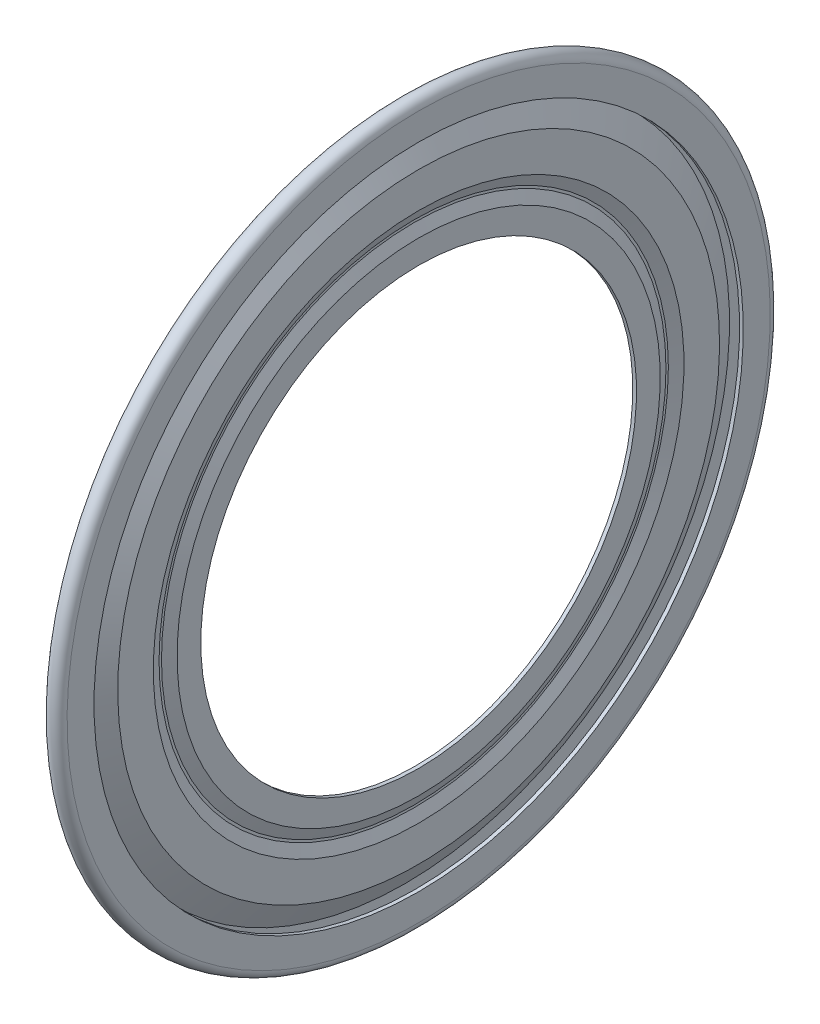
ISO-10303-21;
HEADER;
FILE_DESCRIPTION(('STEP AP214'),'2;1');
FILE_NAME('part.step','',(''),(''),'','','');
FILE_SCHEMA(('AUTOMOTIVE_DESIGN { 1 0 10303 214 1 1 1 1 }'));
ENDSEC;
DATA;
#1=APPLICATION_CONTEXT('core data for automotive mechanical design processes');
#2=APPLICATION_PROTOCOL_DEFINITION('international standard','automotive_design',2000,#1);
#3=PRODUCT_CONTEXT('',#1,'mechanical');
#4=PRODUCT('Part','Part','',(#3));
#5=PRODUCT_RELATED_PRODUCT_CATEGORY('part','',(#4));
#6=PRODUCT_DEFINITION_FORMATION('','',#4);
#7=PRODUCT_DEFINITION_CONTEXT('part definition',#1,'design');
#8=PRODUCT_DEFINITION('design','',#6,#7);
#9=PRODUCT_DEFINITION_SHAPE('','',#8);
#10=(LENGTH_UNIT() NAMED_UNIT(*) SI_UNIT(.MILLI.,.METRE.));
#11=(NAMED_UNIT(*) PLANE_ANGLE_UNIT() SI_UNIT($,.RADIAN.));
#12=(NAMED_UNIT(*) SI_UNIT($,.STERADIAN.) SOLID_ANGLE_UNIT());
#13=UNCERTAINTY_MEASURE_WITH_UNIT(LENGTH_MEASURE(1.E-05),#10,'distance_accuracy_value','');
#14=(GEOMETRIC_REPRESENTATION_CONTEXT(3) GLOBAL_UNCERTAINTY_ASSIGNED_CONTEXT((#13)) GLOBAL_UNIT_ASSIGNED_CONTEXT((#10,
#11,#12)) REPRESENTATION_CONTEXT('',''));
#15=CARTESIAN_POINT('',(0.,0.,0.));
#16=DIRECTION('',(0.,0.,1.));
#17=DIRECTION('',(1.,0.,0.));
#18=AXIS2_PLACEMENT_3D('',#15,#16,#17);
#19=CARTESIAN_POINT('',(6.88333333333333,7.6361065493034,0.));
#20=DIRECTION('',(1.,0.,0.));
#21=DIRECTION('',(0.,-1.,0.));
#22=AXIS2_PLACEMENT_3D('',#19,#20,#21);
#23=PLANE('',#22);
#24=CARTESIAN_POINT('',(6.88333333333333,0.,0.));
#25=DIRECTION('',(-1.,0.,0.));
#26=DIRECTION('',(0.,1.,0.));
#27=AXIS2_PLACEMENT_3D('',#24,#25,#26);
#28=CIRCLE('',#27,7.15613672177468);
#29=CARTESIAN_POINT('',(6.88333333333333,7.15613672177468,0.));
#30=VERTEX_POINT('',#29);
#31=EDGE_CURVE('E11',#30,#30,#28,.T.);
#32=ORIENTED_EDGE('',*,*,#31,.T.);
#33=EDGE_LOOP('',(#32));
#34=FACE_BOUND('',#33,.T.);
#35=CARTESIAN_POINT('',(6.88333333333333,0.,0.));
#36=DIRECTION('',(-1.,0.,0.));
#37=DIRECTION('',(0.,1.,0.));
#38=AXIS2_PLACEMENT_3D('',#35,#36,#37);
#39=CIRCLE('',#38,8.11607637683213);
#40=CARTESIAN_POINT('',(6.88333333333333,8.11607637683213,0.));
#41=VERTEX_POINT('',#40);
#42=EDGE_CURVE('E106',#41,#41,#39,.T.);
#43=ORIENTED_EDGE('',*,*,#42,.F.);
#44=EDGE_LOOP('',(#43));
#45=FACE_BOUND('',#44,.T.);
#46=ADVANCED_FACE('F17',(#34,#45),#23,.T.);
#47=CARTESIAN_POINT('',(6.81666666666667,0.,0.));
#48=DIRECTION('',(1.,0.,0.));
#49=DIRECTION('',(0.,1.,0.));
#50=AXIS2_PLACEMENT_3D('',#47,#48,#49);
#51=CONICAL_SURFACE('',#50,7.01240572463582,1.13650154520197);
#52=CARTESIAN_POINT('',(6.75,0.,0.));
#53=DIRECTION('',(-1.,0.,0.));
#54=DIRECTION('',(0.,1.,0.));
#55=AXIS2_PLACEMENT_3D('',#52,#53,#54);
#56=CIRCLE('',#55,6.86867472749696);
#57=CARTESIAN_POINT('',(6.75,6.86867472749696,0.));
#58=VERTEX_POINT('',#57);
#59=EDGE_CURVE('E27',#58,#58,#56,.T.);
#60=ORIENTED_EDGE('',*,*,#59,.T.);
#61=EDGE_LOOP('',(#60));
#62=FACE_BOUND('',#61,.T.);
#63=ORIENTED_EDGE('',*,*,#31,.F.);
#64=EDGE_LOOP('',(#63));
#65=FACE_BOUND('',#64,.T.);
#66=ADVANCED_FACE('F160',(#62,#65),#51,.F.);
#67=CARTESIAN_POINT('',(6.75,6.83615683675553,0.));
#68=DIRECTION('',(1.,0.,0.));
#69=DIRECTION('',(0.,-1.,0.));
#70=AXIS2_PLACEMENT_3D('',#67,#68,#69);
#71=PLANE('',#70);
#72=CARTESIAN_POINT('',(6.75,0.,0.));
#73=DIRECTION('',(-1.,0.,0.));
#74=DIRECTION('',(0.,1.,0.));
#75=AXIS2_PLACEMENT_3D('',#72,#73,#74);
#76=CIRCLE('',#75,6.8036389460141);
#77=CARTESIAN_POINT('',(6.75,6.8036389460141,0.));
#78=VERTEX_POINT('',#77);
#79=EDGE_CURVE('E130',#78,#78,#76,.T.);
#80=ORIENTED_EDGE('',*,*,#79,.T.);
#81=EDGE_LOOP('',(#80));
#82=FACE_BOUND('',#81,.T.);
#83=ORIENTED_EDGE('',*,*,#59,.F.);
#84=EDGE_LOOP('',(#83));
#85=FACE_BOUND('',#84,.T.);
#86=ADVANCED_FACE('F165',(#82,#85),#71,.T.);
#87=CARTESIAN_POINT('',(6.81666666666667,0.,0.));
#88=DIRECTION('',(-1.,0.,0.));
#89=DIRECTION('',(0.,1.,0.));
#90=AXIS2_PLACEMENT_3D('',#87,#88,#89);
#91=CONICAL_SURFACE('',#90,6.65990794887524,1.13650154520197);
#92=CARTESIAN_POINT('',(6.88333333333333,0.,0.));
#93=DIRECTION('',(-1.,0.,0.));
#94=DIRECTION('',(0.,1.,0.));
#95=AXIS2_PLACEMENT_3D('',#92,#93,#94);
#96=CIRCLE('',#95,6.51617695173638);
#97=CARTESIAN_POINT('',(6.88333333333333,6.51617695173638,0.));
#98=VERTEX_POINT('',#97);
#99=EDGE_CURVE('E117',#98,#98,#96,.T.);
#100=ORIENTED_EDGE('',*,*,#99,.T.);
#101=EDGE_LOOP('',(#100));
#102=FACE_BOUND('',#101,.T.);
#103=ORIENTED_EDGE('',*,*,#79,.F.);
#104=EDGE_LOOP('',(#103));
#105=FACE_BOUND('',#104,.T.);
#106=ADVANCED_FACE('F175',(#102,#105),#91,.T.);
#107=CARTESIAN_POINT('',(6.88333333333333,6.19619706671723,0.));
#108=DIRECTION('',(1.,0.,0.));
#109=DIRECTION('',(0.,-1.,0.));
#110=AXIS2_PLACEMENT_3D('',#107,#108,#109);
#111=PLANE('',#110);
#112=CARTESIAN_POINT('',(6.88333333333333,0.,0.));
#113=DIRECTION('',(-1.,0.,0.));
#114=DIRECTION('',(0.,1.,0.));
#115=AXIS2_PLACEMENT_3D('',#112,#113,#114);
#116=CIRCLE('',#115,5.87621718169808);
#117=CARTESIAN_POINT('',(6.88333333333333,5.87621718169808,0.));
#118=VERTEX_POINT('',#117);
#119=EDGE_CURVE('E115',#118,#118,#116,.T.);
#120=ORIENTED_EDGE('',*,*,#119,.T.);
#121=EDGE_LOOP('',(#120));
#122=FACE_BOUND('',#121,.T.);
#123=ORIENTED_EDGE('',*,*,#99,.F.);
#124=EDGE_LOOP('',(#123));
#125=FACE_BOUND('',#124,.T.);
#126=ADVANCED_FACE('F171',(#122,#125),#111,.T.);
#127=CARTESIAN_POINT('',(6.83333333333333,0.,0.));
#128=DIRECTION('',(1.,0.,0.));
#129=DIRECTION('',(0.,1.,0.));
#130=AXIS2_PLACEMENT_3D('',#127,#128,#129);
#131=CYLINDRICAL_SURFACE('',#130,5.87621718169808);
#132=CARTESIAN_POINT('',(6.78333333333333,0.,0.));
#133=DIRECTION('',(-1.,0.,0.));
#134=DIRECTION('',(0.,1.,0.));
#135=AXIS2_PLACEMENT_3D('',#132,#133,#134);
#136=CIRCLE('',#135,5.87621718169808);
#137=CARTESIAN_POINT('',(6.78333333333333,5.87621718169808,0.));
#138=VERTEX_POINT('',#137);
#139=EDGE_CURVE('E118',#138,#138,#136,.T.);
#140=ORIENTED_EDGE('',*,*,#139,.T.);
#141=EDGE_LOOP('',(#140));
#142=FACE_BOUND('',#141,.T.);
#143=ORIENTED_EDGE('',*,*,#119,.F.);
#144=EDGE_LOOP('',(#143));
#145=FACE_BOUND('',#144,.T.);
#146=ADVANCED_FACE('F174',(#142,#145),#131,.F.);
#147=CARTESIAN_POINT('',(6.78333333333333,6.18516576336283,0.));
#148=DIRECTION('',(-1.,0.,0.));
#149=DIRECTION('',(0.,1.,0.));
#150=AXIS2_PLACEMENT_3D('',#147,#148,#149);
#151=PLANE('',#150);
#152=CARTESIAN_POINT('',(6.78333333333333,0.,0.));
#153=DIRECTION('',(-1.,0.,0.));
#154=DIRECTION('',(0.,1.,0.));
#155=AXIS2_PLACEMENT_3D('',#152,#153,#154);
#156=CIRCLE('',#155,6.49411434502759);
#157=CARTESIAN_POINT('',(6.78333333333333,6.49411434502759,0.));
#158=VERTEX_POINT('',#157);
#159=EDGE_CURVE('E133',#158,#158,#156,.T.);
#160=ORIENTED_EDGE('',*,*,#159,.T.);
#161=EDGE_LOOP('',(#160));
#162=FACE_BOUND('',#161,.T.);
#163=ORIENTED_EDGE('',*,*,#139,.F.);
#164=EDGE_LOOP('',(#163));
#165=FACE_BOUND('',#164,.T.);
#166=ADVANCED_FACE('F193',(#162,#165),#151,.T.);
#167=CARTESIAN_POINT('',(6.71666666666667,0.,0.));
#168=DIRECTION('',(-1.,0.,0.));
#169=DIRECTION('',(0.,1.,0.));
#170=AXIS2_PLACEMENT_3D('',#167,#168,#169);
#171=CONICAL_SURFACE('',#170,6.63784534216645,1.13650154520197);
#172=CARTESIAN_POINT('',(6.65,0.,0.));
#173=DIRECTION('',(-1.,0.,0.));
#174=DIRECTION('',(0.,1.,0.));
#175=AXIS2_PLACEMENT_3D('',#172,#173,#174);
#176=CIRCLE('',#175,6.78157633930531);
#177=CARTESIAN_POINT('',(6.65,6.78157633930531,0.));
#178=VERTEX_POINT('',#177);
#179=EDGE_CURVE('E114',#178,#178,#176,.T.);
#180=ORIENTED_EDGE('',*,*,#179,.T.);
#181=EDGE_LOOP('',(#180));
#182=FACE_BOUND('',#181,.T.);
#183=ORIENTED_EDGE('',*,*,#159,.F.);
#184=EDGE_LOOP('',(#183));
#185=FACE_BOUND('',#184,.T.);
#186=ADVANCED_FACE('F195',(#182,#185),#171,.F.);
#187=CARTESIAN_POINT('',(6.65,6.83615683675553,0.));
#188=DIRECTION('',(-1.,0.,0.));
#189=DIRECTION('',(0.,1.,0.));
#190=AXIS2_PLACEMENT_3D('',#187,#188,#189);
#191=PLANE('',#190);
#192=CARTESIAN_POINT('',(6.65,0.,0.));
#193=DIRECTION('',(-1.,0.,0.));
#194=DIRECTION('',(0.,1.,0.));
#195=AXIS2_PLACEMENT_3D('',#192,#193,#194);
#196=CIRCLE('',#195,6.89073733420575);
#197=CARTESIAN_POINT('',(6.65,6.89073733420575,0.));
#198=VERTEX_POINT('',#197);
#199=EDGE_CURVE('E112',#198,#198,#196,.T.);
#200=ORIENTED_EDGE('',*,*,#199,.T.);
#201=EDGE_LOOP('',(#200));
#202=FACE_BOUND('',#201,.T.);
#203=ORIENTED_EDGE('',*,*,#179,.F.);
#204=EDGE_LOOP('',(#203));
#205=FACE_BOUND('',#204,.T.);
#206=ADVANCED_FACE('F155',(#202,#205),#191,.T.);
#207=CARTESIAN_POINT('',(6.71666666666667,0.,0.));
#208=DIRECTION('',(1.,0.,0.));
#209=DIRECTION('',(0.,1.,0.));
#210=AXIS2_PLACEMENT_3D('',#207,#208,#209);
#211=CONICAL_SURFACE('',#210,7.03446833134461,1.13650154520197);
#212=CARTESIAN_POINT('',(6.78333333333333,0.,0.));
#213=DIRECTION('',(-1.,0.,0.));
#214=DIRECTION('',(0.,1.,0.));
#215=AXIS2_PLACEMENT_3D('',#212,#213,#214);
#216=CIRCLE('',#215,7.17819932848347);
#217=CARTESIAN_POINT('',(6.78333333333333,7.17819932848347,0.));
#218=VERTEX_POINT('',#217);
#219=EDGE_CURVE('E21',#218,#218,#216,.T.);
#220=ORIENTED_EDGE('',*,*,#219,.T.);
#221=EDGE_LOOP('',(#220));
#222=FACE_BOUND('',#221,.T.);
#223=ORIENTED_EDGE('',*,*,#199,.F.);
#224=EDGE_LOOP('',(#223));
#225=FACE_BOUND('',#224,.T.);
#226=ADVANCED_FACE('F140',(#222,#225),#211,.T.);
#227=CARTESIAN_POINT('',(6.78333333333333,7.63374039303625,0.));
#228=DIRECTION('',(-1.,0.,0.));
#229=DIRECTION('',(0.,1.,0.));
#230=AXIS2_PLACEMENT_3D('',#227,#228,#229);
#231=PLANE('',#230);
#232=CARTESIAN_POINT('',(6.78333333333333,0.,0.));
#233=DIRECTION('',(-1.,0.,0.));
#234=DIRECTION('',(0.,1.,0.));
#235=AXIS2_PLACEMENT_3D('',#232,#233,#234);
#236=CIRCLE('',#235,8.08928145758902);
#237=CARTESIAN_POINT('',(6.78333333333333,8.08928145758902,0.));
#238=VERTEX_POINT('',#237);
#239=EDGE_CURVE('E110',#238,#238,#236,.T.);
#240=ORIENTED_EDGE('',*,*,#239,.T.);
#241=EDGE_LOOP('',(#240));
#242=FACE_BOUND('',#241,.T.);
#243=ORIENTED_EDGE('',*,*,#219,.F.);
#244=EDGE_LOOP('',(#243));
#245=FACE_BOUND('',#244,.T.);
#246=ADVANCED_FACE('F143',(#242,#245),#231,.T.);
#247=CARTESIAN_POINT('',(6.6,0.,0.));
#248=DIRECTION('',(-1.,0.,0.));
#249=DIRECTION('',(0.,1.,0.));
#250=AXIS2_PLACEMENT_3D('',#247,#248,#249);
#251=CONICAL_SURFACE('',#250,8.40682410564331,1.0471975511966);
#252=CARTESIAN_POINT('',(6.41666666666667,0.,0.));
#253=DIRECTION('',(-1.,0.,0.));
#254=DIRECTION('',(0.,1.,0.));
#255=AXIS2_PLACEMENT_3D('',#252,#253,#254);
#256=CIRCLE('',#255,8.7243667536976);
#257=CARTESIAN_POINT('',(6.41666666666667,8.7243667536976,0.));
#258=VERTEX_POINT('',#257);
#259=EDGE_CURVE('E109',#258,#258,#256,.T.);
#260=ORIENTED_EDGE('',*,*,#259,.T.);
#261=EDGE_LOOP('',(#260));
#262=FACE_BOUND('',#261,.T.);
#263=ORIENTED_EDGE('',*,*,#239,.F.);
#264=EDGE_LOOP('',(#263));
#265=FACE_BOUND('',#264,.T.);
#266=ADVANCED_FACE('F145',(#262,#265),#251,.F.);
#267=CARTESIAN_POINT('',(6.41666666666667,9.10350461114607,0.));
#268=DIRECTION('',(-1.,0.,0.));
#269=DIRECTION('',(0.,1.,0.));
#270=AXIS2_PLACEMENT_3D('',#267,#268,#269);
#271=PLANE('',#270);
#272=CARTESIAN_POINT('',(6.41666666666667,0.,0.));
#273=DIRECTION('',(-1.,0.,0.));
#274=DIRECTION('',(0.,1.,0.));
#275=AXIS2_PLACEMENT_3D('',#272,#273,#274);
#276=CIRCLE('',#275,9.48264246859454);
#277=CARTESIAN_POINT('',(6.41666666666667,9.48264246859454,0.));
#278=VERTEX_POINT('',#277);
#279=EDGE_CURVE('E78',#278,#278,#276,.T.);
#280=ORIENTED_EDGE('',*,*,#279,.T.);
#281=EDGE_LOOP('',(#280));
#282=FACE_BOUND('',#281,.T.);
#283=ORIENTED_EDGE('',*,*,#259,.F.);
#284=EDGE_LOOP('',(#283));
#285=FACE_BOUND('',#284,.T.);
#286=ADVANCED_FACE('F152',(#282,#285),#271,.T.);
#287=CARTESIAN_POINT('',(6.65,0.,0.));
#288=DIRECTION('',(-1.,0.,0.));
#289=DIRECTION('',(0.,0.,1.));
#290=AXIS2_PLACEMENT_3D('',#287,#288,#289);
#291=TOROIDAL_SURFACE('',#290,9.48264246859454,0.233333333333334);
#292=CARTESIAN_POINT('',(6.88333333333333,0.,0.));
#293=DIRECTION('',(-1.,0.,0.));
#294=DIRECTION('',(0.,1.,0.));
#295=AXIS2_PLACEMENT_3D('',#292,#293,#294);
#296=CIRCLE('',#295,9.48264246859454);
#297=CARTESIAN_POINT('',(6.88333333333333,9.48264246859454,0.));
#298=VERTEX_POINT('',#297);
#299=EDGE_CURVE('E73',#298,#298,#296,.T.);
#300=ORIENTED_EDGE('',*,*,#299,.T.);
#301=EDGE_LOOP('',(#300));
#302=FACE_BOUND('',#301,.T.);
#303=ORIENTED_EDGE('',*,*,#279,.F.);
#304=EDGE_LOOP('',(#303));
#305=FACE_BOUND('',#304,.T.);
#306=ADVANCED_FACE('F19',(#302,#305),#291,.T.);
#307=CARTESIAN_POINT('',(6.88333333333333,9.11933930773249,0.));
#308=DIRECTION('',(1.,0.,0.));
#309=DIRECTION('',(0.,-1.,0.));
#310=AXIS2_PLACEMENT_3D('',#307,#308,#309);
#311=PLANE('',#310);
#312=CARTESIAN_POINT('',(6.88333333333333,0.,0.));
#313=DIRECTION('',(-1.,0.,0.));
#314=DIRECTION('',(0.,1.,0.));
#315=AXIS2_PLACEMENT_3D('',#312,#313,#314);
#316=CIRCLE('',#315,8.75603614687043);
#317=CARTESIAN_POINT('',(6.88333333333333,8.75603614687043,0.));
#318=VERTEX_POINT('',#317);
#319=EDGE_CURVE('E100',#318,#318,#316,.T.);
#320=ORIENTED_EDGE('',*,*,#319,.T.);
#321=EDGE_LOOP('',(#320));
#322=FACE_BOUND('',#321,.T.);
#323=ORIENTED_EDGE('',*,*,#299,.F.);
#324=EDGE_LOOP('',(#323));
#325=FACE_BOUND('',#324,.T.);
#326=ADVANCED_FACE('F177',(#322,#325),#311,.T.);
#327=CARTESIAN_POINT('',(6.83333333333333,0.,0.));
#328=DIRECTION('',(1.,0.,0.));
#329=DIRECTION('',(0.,1.,0.));
#330=AXIS2_PLACEMENT_3D('',#327,#328,#329);
#331=CYLINDRICAL_SURFACE('',#330,8.75603614687043);
#332=CARTESIAN_POINT('',(6.78333333333333,0.,0.));
#333=DIRECTION('',(-1.,0.,0.));
#334=DIRECTION('',(0.,1.,0.));
#335=AXIS2_PLACEMENT_3D('',#332,#333,#334);
#336=CIRCLE('',#335,8.75603614687043);
#337=CARTESIAN_POINT('',(6.78333333333333,8.75603614687043,0.));
#338=VERTEX_POINT('',#337);
#339=EDGE_CURVE('E96',#338,#338,#336,.T.);
#340=ORIENTED_EDGE('',*,*,#339,.T.);
#341=EDGE_LOOP('',(#340));
#342=FACE_BOUND('',#341,.T.);
#343=ORIENTED_EDGE('',*,*,#319,.F.);
#344=EDGE_LOOP('',(#343));
#345=FACE_BOUND('',#344,.T.);
#346=ADVANCED_FACE('F97',(#342,#345),#331,.F.);
#347=CARTESIAN_POINT('',(6.78333333333333,9.11933930773249,0.));
#348=DIRECTION('',(-1.,0.,0.));
#349=DIRECTION('',(0.,1.,0.));
#350=AXIS2_PLACEMENT_3D('',#347,#348,#349);
#351=PLANE('',#350);
#352=CARTESIAN_POINT('',(6.78333333333333,0.,0.));
#353=DIRECTION('',(-1.,0.,0.));
#354=DIRECTION('',(0.,1.,0.));
#355=AXIS2_PLACEMENT_3D('',#352,#353,#354);
#356=CIRCLE('',#355,9.48264246859454);
#357=CARTESIAN_POINT('',(6.78333333333333,9.48264246859454,0.));
#358=VERTEX_POINT('',#357);
#359=EDGE_CURVE('E92',#358,#358,#356,.T.);
#360=ORIENTED_EDGE('',*,*,#359,.T.);
#361=EDGE_LOOP('',(#360));
#362=FACE_BOUND('',#361,.T.);
#363=ORIENTED_EDGE('',*,*,#339,.F.);
#364=EDGE_LOOP('',(#363));
#365=FACE_BOUND('',#364,.T.);
#366=ADVANCED_FACE('F183',(#362,#365),#351,.T.);
#367=CARTESIAN_POINT('',(6.65,0.,0.));
#368=DIRECTION('',(-1.,0.,0.));
#369=DIRECTION('',(0.,0.,1.));
#370=AXIS2_PLACEMENT_3D('',#367,#368,#369);
#371=TOROIDAL_SURFACE('',#370,9.48264246859454,0.133333333333333);
#372=CARTESIAN_POINT('',(6.51666666666667,0.,0.));
#373=DIRECTION('',(-1.,0.,0.));
#374=DIRECTION('',(0.,1.,0.));
#375=AXIS2_PLACEMENT_3D('',#372,#373,#374);
#376=CIRCLE('',#375,9.48264246859454);
#377=CARTESIAN_POINT('',(6.51666666666667,9.48264246859454,0.));
#378=VERTEX_POINT('',#377);
#379=EDGE_CURVE('E103',#378,#378,#376,.T.);
#380=ORIENTED_EDGE('',*,*,#379,.T.);
#381=EDGE_LOOP('',(#380));
#382=FACE_BOUND('',#381,.T.);
#383=ORIENTED_EDGE('',*,*,#359,.F.);
#384=EDGE_LOOP('',(#383));
#385=FACE_BOUND('',#384,.T.);
#386=ADVANCED_FACE('F188',(#382,#385),#371,.F.);
#387=CARTESIAN_POINT('',(6.51666666666667,9.11690207076763,0.));
#388=DIRECTION('',(1.,0.,0.));
#389=DIRECTION('',(0.,-1.,0.));
#390=AXIS2_PLACEMENT_3D('',#387,#388,#389);
#391=PLANE('',#390);
#392=CARTESIAN_POINT('',(6.51666666666667,0.,0.));
#393=DIRECTION('',(-1.,0.,0.));
#394=DIRECTION('',(0.,1.,0.));
#395=AXIS2_PLACEMENT_3D('',#392,#393,#394);
#396=CIRCLE('',#395,8.75116167294072);
#397=CARTESIAN_POINT('',(6.51666666666667,8.75116167294072,0.));
#398=VERTEX_POINT('',#397);
#399=EDGE_CURVE('E119',#398,#398,#396,.T.);
#400=ORIENTED_EDGE('',*,*,#399,.T.);
#401=EDGE_LOOP('',(#400));
#402=FACE_BOUND('',#401,.T.);
#403=ORIENTED_EDGE('',*,*,#379,.F.);
#404=EDGE_LOOP('',(#403));
#405=FACE_BOUND('',#404,.T.);
#406=ADVANCED_FACE('F187',(#402,#405),#391,.T.);
#407=CARTESIAN_POINT('',(6.7,0.,0.));
#408=DIRECTION('',(-1.,0.,0.));
#409=DIRECTION('',(0.,1.,0.));
#410=AXIS2_PLACEMENT_3D('',#407,#408,#409);
#411=CONICAL_SURFACE('',#410,8.43361902488642,1.0471975511966);
#412=ORIENTED_EDGE('',*,*,#42,.T.);
#413=EDGE_LOOP('',(#412));
#414=FACE_BOUND('',#413,.T.);
#415=ORIENTED_EDGE('',*,*,#399,.F.);
#416=EDGE_LOOP('',(#415));
#417=FACE_BOUND('',#416,.T.);
#418=ADVANCED_FACE('F184',(#414,#417),#411,.T.);
#419=CLOSED_SHELL('',(#46,#66,#86,#106,#126,#146,#166,#186,#206,#226,#246,#266,#286,#306,#326,
#346,#366,#386,#406,#418));
#420=MANIFOLD_SOLID_BREP('B1',#419);
#421=ADVANCED_BREP_SHAPE_REPRESENTATION('',(#18,#420),#14);
#422=SHAPE_DEFINITION_REPRESENTATION(#9,#421);
ENDSEC;
END-ISO-10303-21;
